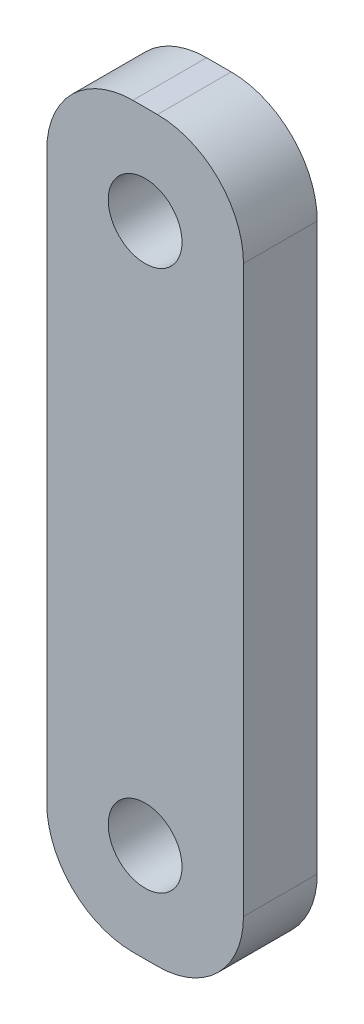
ISO-10303-21;
HEADER;
FILE_DESCRIPTION(('STEP AP214'),'2;1');
FILE_NAME('part.step','',(''),(''),'','','');
FILE_SCHEMA(('AUTOMOTIVE_DESIGN { 1 0 10303 214 1 1 1 1 }'));
ENDSEC;
DATA;
#1=APPLICATION_CONTEXT('core data for automotive mechanical design processes');
#2=APPLICATION_PROTOCOL_DEFINITION('international standard','automotive_design',2000,#1);
#3=PRODUCT_CONTEXT('',#1,'mechanical');
#4=PRODUCT('Part','Part','',(#3));
#5=PRODUCT_RELATED_PRODUCT_CATEGORY('part','',(#4));
#6=PRODUCT_DEFINITION_FORMATION('','',#4);
#7=PRODUCT_DEFINITION_CONTEXT('part definition',#1,'design');
#8=PRODUCT_DEFINITION('design','',#6,#7);
#9=PRODUCT_DEFINITION_SHAPE('','',#8);
#10=(LENGTH_UNIT() NAMED_UNIT(*) SI_UNIT(.MILLI.,.METRE.));
#11=(NAMED_UNIT(*) PLANE_ANGLE_UNIT() SI_UNIT($,.RADIAN.));
#12=(NAMED_UNIT(*) SI_UNIT($,.STERADIAN.) SOLID_ANGLE_UNIT());
#13=UNCERTAINTY_MEASURE_WITH_UNIT(LENGTH_MEASURE(1.E-05),#10,'distance_accuracy_value','');
#14=(GEOMETRIC_REPRESENTATION_CONTEXT(3) GLOBAL_UNCERTAINTY_ASSIGNED_CONTEXT((#13)) GLOBAL_UNIT_ASSIGNED_CONTEXT((#10,
#11,#12)) REPRESENTATION_CONTEXT('',''));
#15=CARTESIAN_POINT('',(0.,0.,0.));
#16=DIRECTION('',(0.,0.,1.));
#17=DIRECTION('',(1.,0.,0.));
#18=AXIS2_PLACEMENT_3D('',#15,#16,#17);
#19=CARTESIAN_POINT('',(-2.1,7.87499999999999,-2.2875));
#20=DIRECTION('',(0.,1.,0.));
#21=DIRECTION('',(-1.,0.,0.));
#22=AXIS2_PLACEMENT_3D('',#19,#20,#21);
#23=PLANE('',#22);
#24=DIRECTION('',(-1.,0.,0.));
#25=VECTOR('',#24,1.);
#26=CARTESIAN_POINT('',(-2.1,7.87499999999999,-2.2875));
#27=LINE('',#26,#25);
#28=CARTESIAN_POINT('',(0.2625,7.87499999999999,-2.2875));
#29=VERTEX_POINT('',#28);
#30=CARTESIAN_POINT('',(-0.262500000000001,7.87499999999999,-2.2875));
#31=VERTEX_POINT('',#30);
#32=EDGE_CURVE('E163',#29,#31,#27,.T.);
#33=ORIENTED_EDGE('',*,*,#32,.T.);
#34=DIRECTION('',(0.,0.,1.));
#35=VECTOR('',#34,1.);
#36=CARTESIAN_POINT('',(-0.262500000000001,7.87499999999999,-2.2875));
#37=LINE('',#36,#35);
#38=CARTESIAN_POINT('',(-0.262500000000001,7.87499999999999,-0.7125));
#39=VERTEX_POINT('',#38);
#40=EDGE_CURVE('E12',#31,#39,#37,.T.);
#41=ORIENTED_EDGE('',*,*,#40,.T.);
#42=DIRECTION('',(-1.,0.,0.));
#43=VECTOR('',#42,1.);
#44=CARTESIAN_POINT('',(-2.1,7.87499999999999,-0.7125));
#45=LINE('',#44,#43);
#46=CARTESIAN_POINT('',(0.2625,7.87499999999999,-0.7125));
#47=VERTEX_POINT('',#46);
#48=EDGE_CURVE('E166',#47,#39,#45,.T.);
#49=ORIENTED_EDGE('',*,*,#48,.F.);
#50=DIRECTION('',(0.,0.,1.));
#51=VECTOR('',#50,1.);
#52=CARTESIAN_POINT('',(0.2625,7.87499999999999,-2.2875));
#53=LINE('',#52,#51);
#54=EDGE_CURVE('E51',#47,#29,#53,.F.);
#55=ORIENTED_EDGE('',*,*,#54,.T.);
#56=EDGE_LOOP('',(#33,#41,#49,#55));
#57=FACE_BOUND('',#56,.T.);
#58=ADVANCED_FACE('F43',(#57),#23,.T.);
#59=CARTESIAN_POINT('',(2.1,-7.875,-2.2875));
#60=DIRECTION('',(1.,0.,0.));
#61=DIRECTION('',(0.,0.,-1.));
#62=AXIS2_PLACEMENT_3D('',#59,#60,#61);
#63=PLANE('',#62);
#64=DIRECTION('',(0.,1.,0.));
#65=VECTOR('',#64,1.);
#66=CARTESIAN_POINT('',(2.1,-7.875,-0.7125));
#67=LINE('',#66,#65);
#68=CARTESIAN_POINT('',(2.1,-6.0375,-0.7125));
#69=VERTEX_POINT('',#68);
#70=CARTESIAN_POINT('',(2.1,6.03749999999999,-0.7125));
#71=VERTEX_POINT('',#70);
#72=EDGE_CURVE('E129',#69,#71,#67,.T.);
#73=ORIENTED_EDGE('',*,*,#72,.F.);
#74=DIRECTION('',(0.,0.,1.));
#75=VECTOR('',#74,1.);
#76=CARTESIAN_POINT('',(2.1,-6.0375,-2.2875));
#77=LINE('',#76,#75);
#78=CARTESIAN_POINT('',(2.1,-6.0375,-2.2875));
#79=VERTEX_POINT('',#78);
#80=EDGE_CURVE('E147',#69,#79,#77,.F.);
#81=ORIENTED_EDGE('',*,*,#80,.T.);
#82=DIRECTION('',(0.,1.,0.));
#83=VECTOR('',#82,1.);
#84=CARTESIAN_POINT('',(2.1,-7.875,-2.2875));
#85=LINE('',#84,#83);
#86=CARTESIAN_POINT('',(2.1,6.03749999999999,-2.2875));
#87=VERTEX_POINT('',#86);
#88=EDGE_CURVE('E132',#79,#87,#85,.T.);
#89=ORIENTED_EDGE('',*,*,#88,.T.);
#90=DIRECTION('',(0.,0.,1.));
#91=VECTOR('',#90,1.);
#92=CARTESIAN_POINT('',(2.1,6.03749999999999,-2.2875));
#93=LINE('',#92,#91);
#94=EDGE_CURVE('E144',#87,#71,#93,.T.);
#95=ORIENTED_EDGE('',*,*,#94,.T.);
#96=EDGE_LOOP('',(#73,#81,#89,#95));
#97=FACE_BOUND('',#96,.T.);
#98=ADVANCED_FACE('F178',(#97),#63,.T.);
#99=CARTESIAN_POINT('',(-2.1,-7.875,-2.2875));
#100=DIRECTION('',(0.,-1.,0.));
#101=DIRECTION('',(1.,0.,0.));
#102=AXIS2_PLACEMENT_3D('',#99,#100,#101);
#103=PLANE('',#102);
#104=DIRECTION('',(1.,0.,0.));
#105=VECTOR('',#104,1.);
#106=CARTESIAN_POINT('',(-2.1,-7.875,-2.2875));
#107=LINE('',#106,#105);
#108=CARTESIAN_POINT('',(-0.2625,-7.875,-2.2875));
#109=VERTEX_POINT('',#108);
#110=CARTESIAN_POINT('',(0.262500000000001,-7.875,-2.2875));
#111=VERTEX_POINT('',#110);
#112=EDGE_CURVE('E137',#109,#111,#107,.T.);
#113=ORIENTED_EDGE('',*,*,#112,.T.);
#114=DIRECTION('',(0.,0.,1.));
#115=VECTOR('',#114,1.);
#116=CARTESIAN_POINT('',(0.262500000000001,-7.875,-2.2875));
#117=LINE('',#116,#115);
#118=CARTESIAN_POINT('',(0.262500000000001,-7.875,-0.7125));
#119=VERTEX_POINT('',#118);
#120=EDGE_CURVE('E128',#111,#119,#117,.T.);
#121=ORIENTED_EDGE('',*,*,#120,.T.);
#122=DIRECTION('',(1.,0.,0.));
#123=VECTOR('',#122,1.);
#124=CARTESIAN_POINT('',(-2.1,-7.875,-0.7125));
#125=LINE('',#124,#123);
#126=CARTESIAN_POINT('',(-0.2625,-7.875,-0.7125));
#127=VERTEX_POINT('',#126);
#128=EDGE_CURVE('E113',#127,#119,#125,.T.);
#129=ORIENTED_EDGE('',*,*,#128,.F.);
#130=DIRECTION('',(0.,0.,1.));
#131=VECTOR('',#130,1.);
#132=CARTESIAN_POINT('',(-0.2625,-7.875,-2.2875));
#133=LINE('',#132,#131);
#134=EDGE_CURVE('E126',#127,#109,#133,.F.);
#135=ORIENTED_EDGE('',*,*,#134,.T.);
#136=EDGE_LOOP('',(#113,#121,#129,#135));
#137=FACE_BOUND('',#136,.T.);
#138=ADVANCED_FACE('F125',(#137),#103,.T.);
#139=CARTESIAN_POINT('',(-2.1,-7.875,-2.2875));
#140=DIRECTION('',(-1.,0.,0.));
#141=DIRECTION('',(0.,0.,1.));
#142=AXIS2_PLACEMENT_3D('',#139,#140,#141);
#143=PLANE('',#142);
#144=DIRECTION('',(0.,-1.,0.));
#145=VECTOR('',#144,1.);
#146=CARTESIAN_POINT('',(-2.1,-7.875,-2.2875));
#147=LINE('',#146,#145);
#148=CARTESIAN_POINT('',(-2.1,6.03749999999999,-2.2875));
#149=VERTEX_POINT('',#148);
#150=CARTESIAN_POINT('',(-2.1,-6.0375,-2.2875));
#151=VERTEX_POINT('',#150);
#152=EDGE_CURVE('E172',#149,#151,#147,.T.);
#153=ORIENTED_EDGE('',*,*,#152,.T.);
#154=DIRECTION('',(0.,0.,1.));
#155=VECTOR('',#154,1.);
#156=CARTESIAN_POINT('',(-2.1,-6.0375,-2.2875));
#157=LINE('',#156,#155);
#158=CARTESIAN_POINT('',(-2.1,-6.0375,-0.7125));
#159=VERTEX_POINT('',#158);
#160=EDGE_CURVE('E157',#151,#159,#157,.T.);
#161=ORIENTED_EDGE('',*,*,#160,.T.);
#162=DIRECTION('',(0.,-1.,0.));
#163=VECTOR('',#162,1.);
#164=CARTESIAN_POINT('',(-2.1,-7.875,-0.7125));
#165=LINE('',#164,#163);
#166=CARTESIAN_POINT('',(-2.1,6.03749999999999,-0.7125));
#167=VERTEX_POINT('',#166);
#168=EDGE_CURVE('E114',#167,#159,#165,.T.);
#169=ORIENTED_EDGE('',*,*,#168,.F.);
#170=DIRECTION('',(0.,0.,1.));
#171=VECTOR('',#170,1.);
#172=CARTESIAN_POINT('',(-2.1,6.03749999999999,-2.2875));
#173=LINE('',#172,#171);
#174=EDGE_CURVE('E65',#167,#149,#173,.F.);
#175=ORIENTED_EDGE('',*,*,#174,.T.);
#176=EDGE_LOOP('',(#153,#161,#169,#175));
#177=FACE_BOUND('',#176,.T.);
#178=ADVANCED_FACE('F218',(#177),#143,.T.);
#179=CARTESIAN_POINT('',(0.,0.,-2.2875));
#180=DIRECTION('',(0.,0.,1.));
#181=DIRECTION('',(1.,0.,0.));
#182=AXIS2_PLACEMENT_3D('',#179,#180,#181);
#183=PLANE('',#182);
#184=CARTESIAN_POINT('',(0.,5.775,-2.2875));
#185=DIRECTION('',(0.,0.,1.));
#186=DIRECTION('',(1.,0.,0.));
#187=AXIS2_PLACEMENT_3D('',#184,#185,#186);
#188=CIRCLE('',#187,0.7875);
#189=CARTESIAN_POINT('',(0.7875,5.775,-2.2875));
#190=VERTEX_POINT('',#189);
#191=EDGE_CURVE('E187',#190,#190,#188,.T.);
#192=ORIENTED_EDGE('',*,*,#191,.T.);
#193=EDGE_LOOP('',(#192));
#194=FACE_BOUND('',#193,.T.);
#195=CARTESIAN_POINT('',(0.,-5.775,-2.2875));
#196=DIRECTION('',(0.,0.,1.));
#197=DIRECTION('',(1.,0.,0.));
#198=AXIS2_PLACEMENT_3D('',#195,#196,#197);
#199=CIRCLE('',#198,0.7875);
#200=CARTESIAN_POINT('',(0.7875,-5.775,-2.2875));
#201=VERTEX_POINT('',#200);
#202=EDGE_CURVE('E189',#201,#201,#199,.T.);
#203=ORIENTED_EDGE('',*,*,#202,.T.);
#204=EDGE_LOOP('',(#203));
#205=FACE_BOUND('',#204,.T.);
#206=ORIENTED_EDGE('',*,*,#88,.F.);
#207=CARTESIAN_POINT('',(0.2625,-6.0375,-2.2875));
#208=DIRECTION('',(0.,0.,1.));
#209=DIRECTION('',(1.,0.,0.));
#210=AXIS2_PLACEMENT_3D('',#207,#208,#209);
#211=CIRCLE('',#210,1.8375);
#212=EDGE_CURVE('E154',#79,#111,#211,.F.);
#213=ORIENTED_EDGE('',*,*,#212,.T.);
#214=ORIENTED_EDGE('',*,*,#112,.F.);
#215=CARTESIAN_POINT('',(-0.2625,-6.0375,-2.2875));
#216=DIRECTION('',(0.,0.,1.));
#217=DIRECTION('',(1.,0.,0.));
#218=AXIS2_PLACEMENT_3D('',#215,#216,#217);
#219=CIRCLE('',#218,1.8375);
#220=EDGE_CURVE('E58',#109,#151,#219,.F.);
#221=ORIENTED_EDGE('',*,*,#220,.T.);
#222=ORIENTED_EDGE('',*,*,#152,.F.);
#223=CARTESIAN_POINT('',(-0.2625,6.03749999999999,-2.2875));
#224=DIRECTION('',(0.,0.,1.));
#225=DIRECTION('',(1.,0.,0.));
#226=AXIS2_PLACEMENT_3D('',#223,#224,#225);
#227=CIRCLE('',#226,1.8375);
#228=EDGE_CURVE('E151',#149,#31,#227,.F.);
#229=ORIENTED_EDGE('',*,*,#228,.T.);
#230=ORIENTED_EDGE('',*,*,#32,.F.);
#231=CARTESIAN_POINT('',(0.2625,6.03749999999999,-2.2875));
#232=DIRECTION('',(0.,0.,1.));
#233=DIRECTION('',(1.,0.,0.));
#234=AXIS2_PLACEMENT_3D('',#231,#232,#233);
#235=CIRCLE('',#234,1.8375);
#236=EDGE_CURVE('E149',#29,#87,#235,.F.);
#237=ORIENTED_EDGE('',*,*,#236,.T.);
#238=EDGE_LOOP('',(#206,#213,#214,#221,#222,#229,#230,#237));
#239=FACE_BOUND('',#238,.T.);
#240=ADVANCED_FACE('F170',(#194,#205,#239),#183,.F.);
#241=CARTESIAN_POINT('',(0.,0.,-0.7125));
#242=DIRECTION('',(0.,0.,1.));
#243=DIRECTION('',(1.,0.,0.));
#244=AXIS2_PLACEMENT_3D('',#241,#242,#243);
#245=PLANE('',#244);
#246=CARTESIAN_POINT('',(0.,5.775,-0.7125));
#247=DIRECTION('',(0.,0.,1.));
#248=DIRECTION('',(1.,0.,0.));
#249=AXIS2_PLACEMENT_3D('',#246,#247,#248);
#250=CIRCLE('',#249,0.7875);
#251=CARTESIAN_POINT('',(0.7875,5.775,-0.7125));
#252=VERTEX_POINT('',#251);
#253=EDGE_CURVE('E194',#252,#252,#250,.T.);
#254=ORIENTED_EDGE('',*,*,#253,.F.);
#255=EDGE_LOOP('',(#254));
#256=FACE_BOUND('',#255,.T.);
#257=CARTESIAN_POINT('',(0.,-5.775,-0.7125));
#258=DIRECTION('',(0.,0.,1.));
#259=DIRECTION('',(1.,0.,0.));
#260=AXIS2_PLACEMENT_3D('',#257,#258,#259);
#261=CIRCLE('',#260,0.7875);
#262=CARTESIAN_POINT('',(0.7875,-5.775,-0.7125));
#263=VERTEX_POINT('',#262);
#264=EDGE_CURVE('E197',#263,#263,#261,.T.);
#265=ORIENTED_EDGE('',*,*,#264,.F.);
#266=EDGE_LOOP('',(#265));
#267=FACE_BOUND('',#266,.T.);
#268=ORIENTED_EDGE('',*,*,#128,.T.);
#269=CARTESIAN_POINT('',(0.2625,-6.0375,-0.7125));
#270=DIRECTION('',(0.,0.,1.));
#271=DIRECTION('',(1.,0.,0.));
#272=AXIS2_PLACEMENT_3D('',#269,#270,#271);
#273=CIRCLE('',#272,1.8375);
#274=EDGE_CURVE('E119',#119,#69,#273,.T.);
#275=ORIENTED_EDGE('',*,*,#274,.T.);
#276=ORIENTED_EDGE('',*,*,#72,.T.);
#277=CARTESIAN_POINT('',(0.2625,6.03749999999999,-0.7125));
#278=DIRECTION('',(0.,0.,1.));
#279=DIRECTION('',(1.,0.,0.));
#280=AXIS2_PLACEMENT_3D('',#277,#278,#279);
#281=CIRCLE('',#280,1.8375);
#282=EDGE_CURVE('E134',#71,#47,#281,.T.);
#283=ORIENTED_EDGE('',*,*,#282,.T.);
#284=ORIENTED_EDGE('',*,*,#48,.T.);
#285=CARTESIAN_POINT('',(-0.2625,6.03749999999999,-0.7125));
#286=DIRECTION('',(0.,0.,1.));
#287=DIRECTION('',(1.,0.,0.));
#288=AXIS2_PLACEMENT_3D('',#285,#286,#287);
#289=CIRCLE('',#288,1.8375);
#290=EDGE_CURVE('E120',#39,#167,#289,.T.);
#291=ORIENTED_EDGE('',*,*,#290,.T.);
#292=ORIENTED_EDGE('',*,*,#168,.T.);
#293=CARTESIAN_POINT('',(-0.2625,-6.0375,-0.7125));
#294=DIRECTION('',(0.,0.,1.));
#295=DIRECTION('',(1.,0.,0.));
#296=AXIS2_PLACEMENT_3D('',#293,#294,#295);
#297=CIRCLE('',#296,1.8375);
#298=EDGE_CURVE('E110',#159,#127,#297,.T.);
#299=ORIENTED_EDGE('',*,*,#298,.T.);
#300=EDGE_LOOP('',(#268,#275,#276,#283,#284,#291,#292,#299));
#301=FACE_BOUND('',#300,.T.);
#302=ADVANCED_FACE('F112',(#256,#267,#301),#245,.T.);
#303=CARTESIAN_POINT('',(0.,-5.775,-2.8125));
#304=DIRECTION('',(0.,0.,1.));
#305=DIRECTION('',(1.,0.,0.));
#306=AXIS2_PLACEMENT_3D('',#303,#304,#305);
#307=CYLINDRICAL_SURFACE('',#306,0.7875);
#308=ORIENTED_EDGE('',*,*,#264,.T.);
#309=EDGE_LOOP('',(#308));
#310=FACE_BOUND('',#309,.T.);
#311=ORIENTED_EDGE('',*,*,#202,.F.);
#312=EDGE_LOOP('',(#311));
#313=FACE_BOUND('',#312,.T.);
#314=ADVANCED_FACE('F208',(#310,#313),#307,.F.);
#315=CARTESIAN_POINT('',(0.,5.775,-2.8125));
#316=DIRECTION('',(0.,0.,1.));
#317=DIRECTION('',(1.,0.,0.));
#318=AXIS2_PLACEMENT_3D('',#315,#316,#317);
#319=CYLINDRICAL_SURFACE('',#318,0.7875);
#320=ORIENTED_EDGE('',*,*,#253,.T.);
#321=EDGE_LOOP('',(#320));
#322=FACE_BOUND('',#321,.T.);
#323=ORIENTED_EDGE('',*,*,#191,.F.);
#324=EDGE_LOOP('',(#323));
#325=FACE_BOUND('',#324,.T.);
#326=ADVANCED_FACE('F203',(#322,#325),#319,.F.);
#327=CARTESIAN_POINT('',(0.2625,-6.0375,-2.2875));
#328=DIRECTION('',(0.,0.,1.));
#329=DIRECTION('',(1.,0.,0.));
#330=AXIS2_PLACEMENT_3D('',#327,#328,#329);
#331=CYLINDRICAL_SURFACE('',#330,1.8375);
#332=ORIENTED_EDGE('',*,*,#212,.F.);
#333=ORIENTED_EDGE('',*,*,#80,.F.);
#334=ORIENTED_EDGE('',*,*,#274,.F.);
#335=ORIENTED_EDGE('',*,*,#120,.F.);
#336=EDGE_LOOP('',(#332,#333,#334,#335));
#337=FACE_BOUND('',#336,.T.);
#338=ADVANCED_FACE('F182',(#337),#331,.T.);
#339=CARTESIAN_POINT('',(-0.2625,-6.0375,-2.2875));
#340=DIRECTION('',(0.,0.,1.));
#341=DIRECTION('',(1.,0.,0.));
#342=AXIS2_PLACEMENT_3D('',#339,#340,#341);
#343=CYLINDRICAL_SURFACE('',#342,1.8375);
#344=ORIENTED_EDGE('',*,*,#220,.F.);
#345=ORIENTED_EDGE('',*,*,#134,.F.);
#346=ORIENTED_EDGE('',*,*,#298,.F.);
#347=ORIENTED_EDGE('',*,*,#160,.F.);
#348=EDGE_LOOP('',(#344,#345,#346,#347));
#349=FACE_BOUND('',#348,.T.);
#350=ADVANCED_FACE('F131',(#349),#343,.T.);
#351=CARTESIAN_POINT('',(-0.2625,6.03749999999999,-2.2875));
#352=DIRECTION('',(0.,0.,1.));
#353=DIRECTION('',(1.,0.,0.));
#354=AXIS2_PLACEMENT_3D('',#351,#352,#353);
#355=CYLINDRICAL_SURFACE('',#354,1.8375);
#356=ORIENTED_EDGE('',*,*,#228,.F.);
#357=ORIENTED_EDGE('',*,*,#174,.F.);
#358=ORIENTED_EDGE('',*,*,#290,.F.);
#359=ORIENTED_EDGE('',*,*,#40,.F.);
#360=EDGE_LOOP('',(#356,#357,#358,#359));
#361=FACE_BOUND('',#360,.T.);
#362=ADVANCED_FACE('F235',(#361),#355,.T.);
#363=CARTESIAN_POINT('',(0.2625,6.03749999999999,-2.2875));
#364=DIRECTION('',(0.,0.,1.));
#365=DIRECTION('',(1.,0.,0.));
#366=AXIS2_PLACEMENT_3D('',#363,#364,#365);
#367=CYLINDRICAL_SURFACE('',#366,1.8375);
#368=ORIENTED_EDGE('',*,*,#236,.F.);
#369=ORIENTED_EDGE('',*,*,#54,.F.);
#370=ORIENTED_EDGE('',*,*,#282,.F.);
#371=ORIENTED_EDGE('',*,*,#94,.F.);
#372=EDGE_LOOP('',(#368,#369,#370,#371));
#373=FACE_BOUND('',#372,.T.);
#374=ADVANCED_FACE('F45',(#373),#367,.T.);
#375=CLOSED_SHELL('',(#58,#98,#138,#178,#240,#302,#314,#326,#338,#350,#362,#374));
#376=MANIFOLD_SOLID_BREP('B2',#375);
#377=ADVANCED_BREP_SHAPE_REPRESENTATION('',(#18,#376),#14);
#378=SHAPE_DEFINITION_REPRESENTATION(#9,#377);
ENDSEC;
END-ISO-10303-21;
